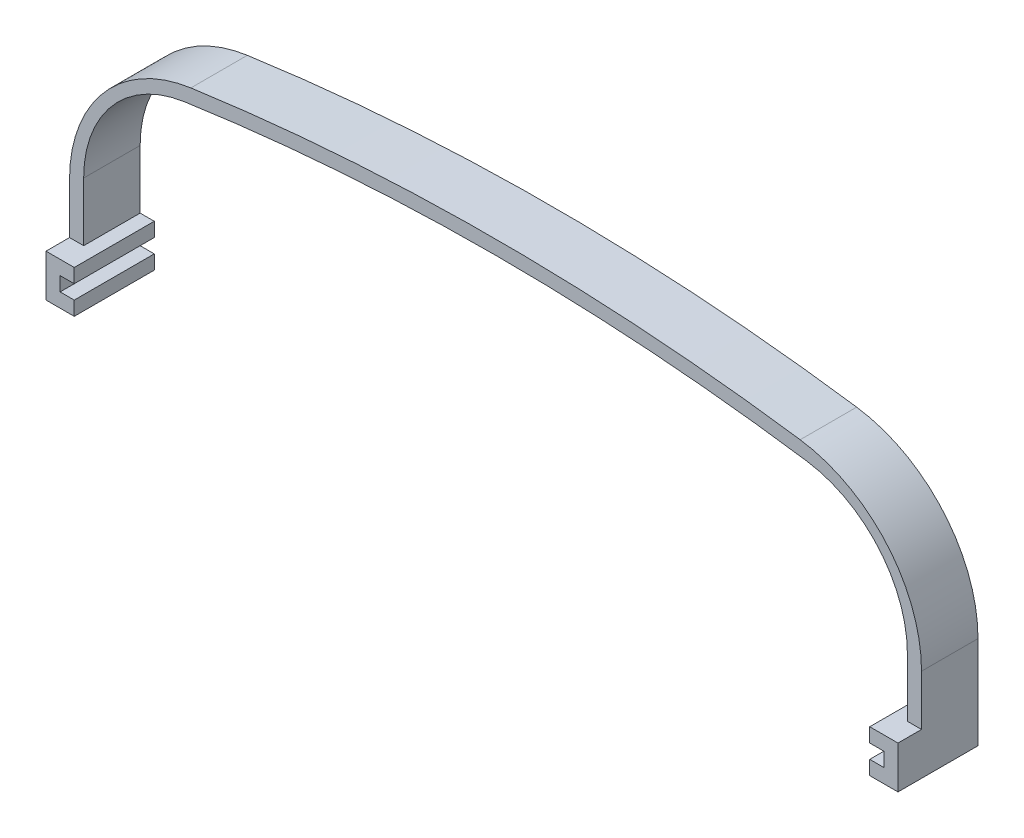
ISO-10303-21;
HEADER;
FILE_DESCRIPTION(('STEP AP214'),'2;1');
FILE_NAME('part.step','',(''),(''),'','','');
FILE_SCHEMA(('AUTOMOTIVE_DESIGN { 1 0 10303 214 1 1 1 1 }'));
ENDSEC;
DATA;
#1=APPLICATION_CONTEXT('core data for automotive mechanical design processes');
#2=APPLICATION_PROTOCOL_DEFINITION('international standard','automotive_design',2000,#1);
#3=PRODUCT_CONTEXT('',#1,'mechanical');
#4=PRODUCT('Part','Part','',(#3));
#5=PRODUCT_RELATED_PRODUCT_CATEGORY('part','',(#4));
#6=PRODUCT_DEFINITION_FORMATION('','',#4);
#7=PRODUCT_DEFINITION_CONTEXT('part definition',#1,'design');
#8=PRODUCT_DEFINITION('design','',#6,#7);
#9=PRODUCT_DEFINITION_SHAPE('','',#8);
#10=(LENGTH_UNIT() NAMED_UNIT(*) SI_UNIT(.MILLI.,.METRE.));
#11=(NAMED_UNIT(*) PLANE_ANGLE_UNIT() SI_UNIT($,.RADIAN.));
#12=(NAMED_UNIT(*) SI_UNIT($,.STERADIAN.) SOLID_ANGLE_UNIT());
#13=UNCERTAINTY_MEASURE_WITH_UNIT(LENGTH_MEASURE(1.E-05),#10,'distance_accuracy_value','');
#14=(GEOMETRIC_REPRESENTATION_CONTEXT(3) GLOBAL_UNCERTAINTY_ASSIGNED_CONTEXT((#13)) GLOBAL_UNIT_ASSIGNED_CONTEXT((#10,
#11,#12)) REPRESENTATION_CONTEXT('',''));
#15=CARTESIAN_POINT('',(0.,0.,0.));
#16=DIRECTION('',(0.,0.,1.));
#17=DIRECTION('',(1.,0.,0.));
#18=AXIS2_PLACEMENT_3D('',#15,#16,#17);
#19=CARTESIAN_POINT('',(0.,-408.513888888885,12.));
#20=DIRECTION('',(0.,0.,-1.));
#21=DIRECTION('',(-1.,0.,0.));
#22=AXIS2_PLACEMENT_3D('',#19,#20,#21);
#23=PLANE('',#22);
#24=CARTESIAN_POINT('',(0.,-408.513888888885,12.));
#25=DIRECTION('',(0.,0.,1.));
#26=DIRECTION('',(-1.,0.,0.));
#27=AXIS2_PLACEMENT_3D('',#24,#25,#26);
#28=CIRCLE('',#27,459.513888888885);
#29=CARTESIAN_POINT('',(64.7257073565077,46.4186301609036,12.));
#30=VERTEX_POINT('',#29);
#31=CARTESIAN_POINT('',(-64.7257073565077,46.4186301609036,12.));
#32=VERTEX_POINT('',#31);
#33=EDGE_CURVE('E330',#30,#32,#28,.T.);
#34=ORIENTED_EDGE('',*,*,#33,.T.);
#35=CARTESIAN_POINT('',(-60.5,16.7177312294376,12.));
#36=DIRECTION('',(0.,0.,-1.));
#37=DIRECTION('',(-1.,0.,0.));
#38=AXIS2_PLACEMENT_3D('',#35,#36,#37);
#39=CIRCLE('',#38,30.);
#40=CARTESIAN_POINT('',(-90.5,16.7177312294376,12.));
#41=VERTEX_POINT('',#40);
#42=EDGE_CURVE('E41',#32,#41,#39,.F.);
#43=ORIENTED_EDGE('',*,*,#42,.T.);
#44=DIRECTION('',(0.,1.,0.));
#45=VECTOR('',#44,1.);
#46=CARTESIAN_POINT('',(-90.5,-3.,12.));
#47=LINE('',#46,#45);
#48=CARTESIAN_POINT('',(-90.5,6.,12.));
#49=VERTEX_POINT('',#48);
#50=EDGE_CURVE('E260',#49,#41,#47,.T.);
#51=ORIENTED_EDGE('',*,*,#50,.F.);
#52=DIRECTION('',(1.,0.,0.));
#53=VECTOR('',#52,1.);
#54=CARTESIAN_POINT('',(-84.5,6.,12.));
#55=LINE('',#54,#53);
#56=CARTESIAN_POINT('',(-87.5,6.,12.));
#57=VERTEX_POINT('',#56);
#58=EDGE_CURVE('E233',#49,#57,#55,.T.);
#59=ORIENTED_EDGE('',*,*,#58,.T.);
#60=DIRECTION('',(0.,-1.,0.));
#61=VECTOR('',#60,1.);
#62=CARTESIAN_POINT('',(-87.5,6.,12.));
#63=LINE('',#62,#61);
#64=CARTESIAN_POINT('',(-87.5,18.4497937634092,12.));
#65=VERTEX_POINT('',#64);
#66=EDGE_CURVE('E258',#65,#57,#63,.T.);
#67=ORIENTED_EDGE('',*,*,#66,.F.);
#68=CARTESIAN_POINT('',(-62.5,18.4497937634092,12.));
#69=DIRECTION('',(0.,0.,-1.));
#70=DIRECTION('',(-1.,0.,0.));
#71=AXIS2_PLACEMENT_3D('',#68,#69,#70);
#72=CIRCLE('',#71,25.);
#73=CARTESIAN_POINT('',(-66.1209726737263,43.186175004329,12.));
#74=VERTEX_POINT('',#73);
#75=EDGE_CURVE('E396',#65,#74,#72,.T.);
#76=ORIENTED_EDGE('',*,*,#75,.T.);
#77=CARTESIAN_POINT('',(0.,-408.513888888885,12.));
#78=DIRECTION('',(0.,0.,-1.));
#79=DIRECTION('',(1.,0.,0.));
#80=AXIS2_PLACEMENT_3D('',#77,#78,#79);
#81=CIRCLE('',#80,456.513888888885);
#82=CARTESIAN_POINT('',(66.1209726737263,43.186175004329,12.));
#83=VERTEX_POINT('',#82);
#84=EDGE_CURVE('E333',#74,#83,#81,.T.);
#85=ORIENTED_EDGE('',*,*,#84,.T.);
#86=CARTESIAN_POINT('',(62.5,18.4497937634092,12.));
#87=DIRECTION('',(0.,0.,-1.));
#88=DIRECTION('',(-1.,0.,0.));
#89=AXIS2_PLACEMENT_3D('',#86,#87,#88);
#90=CIRCLE('',#89,25.);
#91=CARTESIAN_POINT('',(87.5,18.4497937634092,12.));
#92=VERTEX_POINT('',#91);
#93=EDGE_CURVE('E400',#83,#92,#90,.T.);
#94=ORIENTED_EDGE('',*,*,#93,.T.);
#95=DIRECTION('',(0.,-1.,0.));
#96=VECTOR('',#95,1.);
#97=CARTESIAN_POINT('',(87.5,6.,12.));
#98=LINE('',#97,#96);
#99=CARTESIAN_POINT('',(87.5,6.,12.));
#100=VERTEX_POINT('',#99);
#101=EDGE_CURVE('E336',#92,#100,#98,.T.);
#102=ORIENTED_EDGE('',*,*,#101,.T.);
#103=DIRECTION('',(-1.,0.,0.));
#104=VECTOR('',#103,1.);
#105=CARTESIAN_POINT('',(84.5,6.,12.));
#106=LINE('',#105,#104);
#107=CARTESIAN_POINT('',(90.5,6.,12.));
#108=VERTEX_POINT('',#107);
#109=EDGE_CURVE('E297',#108,#100,#106,.T.);
#110=ORIENTED_EDGE('',*,*,#109,.F.);
#111=DIRECTION('',(0.,1.,0.));
#112=VECTOR('',#111,1.);
#113=CARTESIAN_POINT('',(90.5,-3.,12.));
#114=LINE('',#113,#112);
#115=CARTESIAN_POINT('',(90.5,16.7177312294376,12.));
#116=VERTEX_POINT('',#115);
#117=EDGE_CURVE('E328',#108,#116,#114,.T.);
#118=ORIENTED_EDGE('',*,*,#117,.T.);
#119=CARTESIAN_POINT('',(60.5,16.7177312294376,12.));
#120=DIRECTION('',(0.,0.,-1.));
#121=DIRECTION('',(-1.,0.,0.));
#122=AXIS2_PLACEMENT_3D('',#119,#120,#121);
#123=CIRCLE('',#122,30.);
#124=EDGE_CURVE('E412',#116,#30,#123,.F.);
#125=ORIENTED_EDGE('',*,*,#124,.T.);
#126=EDGE_LOOP('',(#34,#43,#51,#59,#67,#76,#85,#94,#102,#110,#118,#125));
#127=FACE_BOUND('',#126,.T.);
#128=ADVANCED_FACE('F33',(#127),#23,.F.);
#129=CARTESIAN_POINT('',(84.5,0.,12.));
#130=DIRECTION('',(1.,0.,0.));
#131=DIRECTION('',(0.,0.,-1.));
#132=AXIS2_PLACEMENT_3D('',#129,#130,#131);
#133=PLANE('',#132);
#134=DIRECTION('',(0.,-1.,0.));
#135=VECTOR('',#134,1.);
#136=CARTESIAN_POINT('',(84.5,0.,0.));
#137=LINE('',#136,#135);
#138=CARTESIAN_POINT('',(84.5,0.,0.));
#139=VERTEX_POINT('',#138);
#140=CARTESIAN_POINT('',(84.5,-3.,0.));
#141=VERTEX_POINT('',#140);
#142=EDGE_CURVE('E327',#139,#141,#137,.T.);
#143=ORIENTED_EDGE('',*,*,#142,.T.);
#144=DIRECTION('',(0.,0.,-1.));
#145=VECTOR('',#144,1.);
#146=CARTESIAN_POINT('',(84.5,-3.,12.));
#147=LINE('',#146,#145);
#148=CARTESIAN_POINT('',(84.5,-3.,17.));
#149=VERTEX_POINT('',#148);
#150=EDGE_CURVE('E381',#149,#141,#147,.T.);
#151=ORIENTED_EDGE('',*,*,#150,.F.);
#152=DIRECTION('',(0.,-1.,0.));
#153=VECTOR('',#152,1.);
#154=CARTESIAN_POINT('',(84.5,-3.,17.));
#155=LINE('',#154,#153);
#156=CARTESIAN_POINT('',(84.5,0.,17.));
#157=VERTEX_POINT('',#156);
#158=EDGE_CURVE('E316',#157,#149,#155,.T.);
#159=ORIENTED_EDGE('',*,*,#158,.F.);
#160=DIRECTION('',(0.,0.,-1.));
#161=VECTOR('',#160,1.);
#162=CARTESIAN_POINT('',(84.5,0.,12.));
#163=LINE('',#162,#161);
#164=EDGE_CURVE('E338',#157,#139,#163,.T.);
#165=ORIENTED_EDGE('',*,*,#164,.T.);
#166=EDGE_LOOP('',(#143,#151,#159,#165));
#167=FACE_BOUND('',#166,.T.);
#168=ADVANCED_FACE('F439',(#167),#133,.F.);
#169=CARTESIAN_POINT('',(84.5,-3.,12.));
#170=DIRECTION('',(0.,1.,0.));
#171=DIRECTION('',(0.,0.,1.));
#172=AXIS2_PLACEMENT_3D('',#169,#170,#171);
#173=PLANE('',#172);
#174=DIRECTION('',(1.,0.,0.));
#175=VECTOR('',#174,1.);
#176=CARTESIAN_POINT('',(84.5,-3.,0.));
#177=LINE('',#176,#175);
#178=CARTESIAN_POINT('',(90.5,-3.,0.));
#179=VERTEX_POINT('',#178);
#180=EDGE_CURVE('E341',#141,#179,#177,.T.);
#181=ORIENTED_EDGE('',*,*,#180,.T.);
#182=DIRECTION('',(0.,0.,-1.));
#183=VECTOR('',#182,1.);
#184=CARTESIAN_POINT('',(90.5,-3.,12.));
#185=LINE('',#184,#183);
#186=CARTESIAN_POINT('',(90.5,-3.,17.));
#187=VERTEX_POINT('',#186);
#188=EDGE_CURVE('E378',#187,#179,#185,.T.);
#189=ORIENTED_EDGE('',*,*,#188,.F.);
#190=DIRECTION('',(1.,0.,0.));
#191=VECTOR('',#190,1.);
#192=CARTESIAN_POINT('',(90.5,-3.,17.));
#193=LINE('',#192,#191);
#194=EDGE_CURVE('E319',#149,#187,#193,.T.);
#195=ORIENTED_EDGE('',*,*,#194,.F.);
#196=ORIENTED_EDGE('',*,*,#150,.T.);
#197=EDGE_LOOP('',(#181,#189,#195,#196));
#198=FACE_BOUND('',#197,.T.);
#199=ADVANCED_FACE('F433',(#198),#173,.F.);
#200=CARTESIAN_POINT('',(90.5,-3.,12.));
#201=DIRECTION('',(-1.,0.,0.));
#202=DIRECTION('',(0.,0.,1.));
#203=AXIS2_PLACEMENT_3D('',#200,#201,#202);
#204=PLANE('',#203);
#205=DIRECTION('',(0.,1.,0.));
#206=VECTOR('',#205,1.);
#207=CARTESIAN_POINT('',(90.5,-3.,0.));
#208=LINE('',#207,#206);
#209=CARTESIAN_POINT('',(90.5,16.7177312294376,0.));
#210=VERTEX_POINT('',#209);
#211=EDGE_CURVE('E343',#179,#210,#208,.T.);
#212=ORIENTED_EDGE('',*,*,#211,.T.);
#213=DIRECTION('',(0.,0.,-1.));
#214=VECTOR('',#213,1.);
#215=CARTESIAN_POINT('',(90.5,16.7177312294376,12.));
#216=LINE('',#215,#214);
#217=EDGE_CURVE('E11',#210,#116,#216,.F.);
#218=ORIENTED_EDGE('',*,*,#217,.T.);
#219=ORIENTED_EDGE('',*,*,#117,.F.);
#220=DIRECTION('',(0.,0.,-1.));
#221=VECTOR('',#220,1.);
#222=CARTESIAN_POINT('',(90.5,6.,17.));
#223=LINE('',#222,#221);
#224=CARTESIAN_POINT('',(90.5,6.,17.));
#225=VERTEX_POINT('',#224);
#226=EDGE_CURVE('E322',#225,#108,#223,.T.);
#227=ORIENTED_EDGE('',*,*,#226,.F.);
#228=DIRECTION('',(0.,1.,0.));
#229=VECTOR('',#228,1.);
#230=CARTESIAN_POINT('',(90.5,6.,17.));
#231=LINE('',#230,#229);
#232=EDGE_CURVE('E298',#187,#225,#231,.T.);
#233=ORIENTED_EDGE('',*,*,#232,.F.);
#234=ORIENTED_EDGE('',*,*,#188,.T.);
#235=EDGE_LOOP('',(#212,#218,#219,#227,#233,#234));
#236=FACE_BOUND('',#235,.T.);
#237=ADVANCED_FACE('F428',(#236),#204,.F.);
#238=CARTESIAN_POINT('',(0.,-408.513888888885,12.));
#239=DIRECTION('',(0.,0.,-1.));
#240=DIRECTION('',(-1.,0.,0.));
#241=AXIS2_PLACEMENT_3D('',#238,#239,#240);
#242=CYLINDRICAL_SURFACE('',#241,459.513888888885);
#243=CARTESIAN_POINT('',(0.,-408.513888888885,0.));
#244=DIRECTION('',(0.,0.,1.));
#245=DIRECTION('',(-1.,0.,0.));
#246=AXIS2_PLACEMENT_3D('',#243,#244,#245);
#247=CIRCLE('',#246,459.513888888885);
#248=CARTESIAN_POINT('',(64.7257073565077,46.4186301609036,0.));
#249=VERTEX_POINT('',#248);
#250=CARTESIAN_POINT('',(-64.7257073565077,46.4186301609036,0.));
#251=VERTEX_POINT('',#250);
#252=EDGE_CURVE('E345',#249,#251,#247,.T.);
#253=ORIENTED_EDGE('',*,*,#252,.T.);
#254=DIRECTION('',(0.,0.,-1.));
#255=VECTOR('',#254,1.);
#256=CARTESIAN_POINT('',(-64.7257073565077,46.4186301609037,12.));
#257=LINE('',#256,#255);
#258=EDGE_CURVE('E54',#251,#32,#257,.F.);
#259=ORIENTED_EDGE('',*,*,#258,.T.);
#260=ORIENTED_EDGE('',*,*,#33,.F.);
#261=DIRECTION('',(0.,0.,-1.));
#262=VECTOR('',#261,1.);
#263=CARTESIAN_POINT('',(64.7257073565077,46.4186301609037,12.));
#264=LINE('',#263,#262);
#265=EDGE_CURVE('E408',#30,#249,#264,.T.);
#266=ORIENTED_EDGE('',*,*,#265,.T.);
#267=EDGE_LOOP('',(#253,#259,#260,#266));
#268=FACE_BOUND('',#267,.T.);
#269=ADVANCED_FACE('F423',(#268),#242,.T.);
#270=CARTESIAN_POINT('',(0.,-408.513888888885,12.));
#271=DIRECTION('',(0.,0.,-1.));
#272=DIRECTION('',(-1.,0.,0.));
#273=AXIS2_PLACEMENT_3D('',#270,#271,#272);
#274=CYLINDRICAL_SURFACE('',#273,456.513888888885);
#275=ORIENTED_EDGE('',*,*,#84,.F.);
#276=DIRECTION('',(0.,0.,-1.));
#277=VECTOR('',#276,1.);
#278=CARTESIAN_POINT('',(-66.1209726737263,43.1861750043291,12.));
#279=LINE('',#278,#277);
#280=CARTESIAN_POINT('',(-66.1209726737263,43.186175004329,0.));
#281=VERTEX_POINT('',#280);
#282=EDGE_CURVE('E386',#74,#281,#279,.T.);
#283=ORIENTED_EDGE('',*,*,#282,.T.);
#284=CARTESIAN_POINT('',(0.,-408.513888888885,0.));
#285=DIRECTION('',(0.,0.,-1.));
#286=DIRECTION('',(1.,0.,0.));
#287=AXIS2_PLACEMENT_3D('',#284,#285,#286);
#288=CIRCLE('',#287,456.513888888885);
#289=CARTESIAN_POINT('',(66.1209726737263,43.186175004329,0.));
#290=VERTEX_POINT('',#289);
#291=EDGE_CURVE('E347',#281,#290,#288,.T.);
#292=ORIENTED_EDGE('',*,*,#291,.T.);
#293=DIRECTION('',(0.,0.,-1.));
#294=VECTOR('',#293,1.);
#295=CARTESIAN_POINT('',(66.1209726737263,43.1861750043291,12.));
#296=LINE('',#295,#294);
#297=EDGE_CURVE('E384',#290,#83,#296,.F.);
#298=ORIENTED_EDGE('',*,*,#297,.T.);
#299=EDGE_LOOP('',(#275,#283,#292,#298));
#300=FACE_BOUND('',#299,.T.);
#301=ADVANCED_FACE('F470',(#300),#274,.F.);
#302=CARTESIAN_POINT('',(87.5,6.,12.));
#303=DIRECTION('',(1.,0.,0.));
#304=DIRECTION('',(0.,0.,-1.));
#305=AXIS2_PLACEMENT_3D('',#302,#303,#304);
#306=PLANE('',#305);
#307=ORIENTED_EDGE('',*,*,#101,.F.);
#308=DIRECTION('',(0.,0.,1.));
#309=VECTOR('',#308,1.);
#310=CARTESIAN_POINT('',(87.5,18.4497937634092,0.));
#311=LINE('',#310,#309);
#312=CARTESIAN_POINT('',(87.5,18.4497937634092,0.));
#313=VERTEX_POINT('',#312);
#314=EDGE_CURVE('E391',#92,#313,#311,.F.);
#315=ORIENTED_EDGE('',*,*,#314,.T.);
#316=DIRECTION('',(0.,-1.,0.));
#317=VECTOR('',#316,1.);
#318=CARTESIAN_POINT('',(87.5,6.,0.));
#319=LINE('',#318,#317);
#320=CARTESIAN_POINT('',(87.5,6.,0.));
#321=VERTEX_POINT('',#320);
#322=EDGE_CURVE('E350',#313,#321,#319,.T.);
#323=ORIENTED_EDGE('',*,*,#322,.T.);
#324=DIRECTION('',(0.,0.,-1.));
#325=VECTOR('',#324,1.);
#326=CARTESIAN_POINT('',(87.5,6.,12.));
#327=LINE('',#326,#325);
#328=EDGE_CURVE('E375',#100,#321,#327,.T.);
#329=ORIENTED_EDGE('',*,*,#328,.F.);
#330=EDGE_LOOP('',(#307,#315,#323,#329));
#331=FACE_BOUND('',#330,.T.);
#332=ADVANCED_FACE('F463',(#331),#306,.F.);
#333=CARTESIAN_POINT('',(84.5,6.,12.));
#334=DIRECTION('',(0.,-1.,0.));
#335=DIRECTION('',(1.,0.,0.));
#336=AXIS2_PLACEMENT_3D('',#333,#334,#335);
#337=PLANE('',#336);
#338=DIRECTION('',(-1.,0.,0.));
#339=VECTOR('',#338,1.);
#340=CARTESIAN_POINT('',(84.5,6.,0.));
#341=LINE('',#340,#339);
#342=CARTESIAN_POINT('',(84.5,6.,0.));
#343=VERTEX_POINT('',#342);
#344=EDGE_CURVE('E352',#321,#343,#341,.T.);
#345=ORIENTED_EDGE('',*,*,#344,.T.);
#346=DIRECTION('',(0.,0.,-1.));
#347=VECTOR('',#346,1.);
#348=CARTESIAN_POINT('',(84.5,6.,12.));
#349=LINE('',#348,#347);
#350=CARTESIAN_POINT('',(84.5,6.,17.));
#351=VERTEX_POINT('',#350);
#352=EDGE_CURVE('E372',#351,#343,#349,.T.);
#353=ORIENTED_EDGE('',*,*,#352,.F.);
#354=DIRECTION('',(-1.,0.,0.));
#355=VECTOR('',#354,1.);
#356=CARTESIAN_POINT('',(84.5,6.,17.));
#357=LINE('',#356,#355);
#358=EDGE_CURVE('E301',#225,#351,#357,.T.);
#359=ORIENTED_EDGE('',*,*,#358,.F.);
#360=ORIENTED_EDGE('',*,*,#226,.T.);
#361=ORIENTED_EDGE('',*,*,#109,.T.);
#362=ORIENTED_EDGE('',*,*,#328,.T.);
#363=EDGE_LOOP('',(#345,#353,#359,#360,#361,#362));
#364=FACE_BOUND('',#363,.T.);
#365=ADVANCED_FACE('F459',(#364),#337,.F.);
#366=CARTESIAN_POINT('',(84.5,3.,12.));
#367=DIRECTION('',(1.,0.,0.));
#368=DIRECTION('',(0.,0.,-1.));
#369=AXIS2_PLACEMENT_3D('',#366,#367,#368);
#370=PLANE('',#369);
#371=DIRECTION('',(0.,-1.,0.));
#372=VECTOR('',#371,1.);
#373=CARTESIAN_POINT('',(84.5,3.,0.));
#374=LINE('',#373,#372);
#375=CARTESIAN_POINT('',(84.5,3.,0.));
#376=VERTEX_POINT('',#375);
#377=EDGE_CURVE('E354',#343,#376,#374,.T.);
#378=ORIENTED_EDGE('',*,*,#377,.T.);
#379=DIRECTION('',(0.,0.,-1.));
#380=VECTOR('',#379,1.);
#381=CARTESIAN_POINT('',(84.5,3.,12.));
#382=LINE('',#381,#380);
#383=CARTESIAN_POINT('',(84.5,3.,17.));
#384=VERTEX_POINT('',#383);
#385=EDGE_CURVE('E369',#384,#376,#382,.T.);
#386=ORIENTED_EDGE('',*,*,#385,.F.);
#387=DIRECTION('',(0.,-1.,0.));
#388=VECTOR('',#387,1.);
#389=CARTESIAN_POINT('',(84.5,3.,17.));
#390=LINE('',#389,#388);
#391=EDGE_CURVE('E304',#351,#384,#390,.T.);
#392=ORIENTED_EDGE('',*,*,#391,.F.);
#393=ORIENTED_EDGE('',*,*,#352,.T.);
#394=EDGE_LOOP('',(#378,#386,#392,#393));
#395=FACE_BOUND('',#394,.T.);
#396=ADVANCED_FACE('F457',(#395),#370,.F.);
#397=CARTESIAN_POINT('',(87.5,3.,12.));
#398=DIRECTION('',(0.,1.,0.));
#399=DIRECTION('',(-1.,0.,0.));
#400=AXIS2_PLACEMENT_3D('',#397,#398,#399);
#401=PLANE('',#400);
#402=DIRECTION('',(1.,0.,0.));
#403=VECTOR('',#402,1.);
#404=CARTESIAN_POINT('',(87.5,3.,0.));
#405=LINE('',#404,#403);
#406=CARTESIAN_POINT('',(87.5,3.,0.));
#407=VERTEX_POINT('',#406);
#408=EDGE_CURVE('E356',#376,#407,#405,.T.);
#409=ORIENTED_EDGE('',*,*,#408,.T.);
#410=DIRECTION('',(0.,0.,-1.));
#411=VECTOR('',#410,1.);
#412=CARTESIAN_POINT('',(87.5,3.,12.));
#413=LINE('',#412,#411);
#414=CARTESIAN_POINT('',(87.5,3.,17.));
#415=VERTEX_POINT('',#414);
#416=EDGE_CURVE('E366',#415,#407,#413,.T.);
#417=ORIENTED_EDGE('',*,*,#416,.F.);
#418=DIRECTION('',(1.,0.,0.));
#419=VECTOR('',#418,1.);
#420=CARTESIAN_POINT('',(87.5,3.,17.));
#421=LINE('',#420,#419);
#422=EDGE_CURVE('E307',#384,#415,#421,.T.);
#423=ORIENTED_EDGE('',*,*,#422,.F.);
#424=ORIENTED_EDGE('',*,*,#385,.T.);
#425=EDGE_LOOP('',(#409,#417,#423,#424));
#426=FACE_BOUND('',#425,.T.);
#427=ADVANCED_FACE('F452',(#426),#401,.F.);
#428=CARTESIAN_POINT('',(87.5,0.,12.));
#429=DIRECTION('',(1.,0.,0.));
#430=DIRECTION('',(0.,0.,-1.));
#431=AXIS2_PLACEMENT_3D('',#428,#429,#430);
#432=PLANE('',#431);
#433=DIRECTION('',(0.,-1.,0.));
#434=VECTOR('',#433,1.);
#435=CARTESIAN_POINT('',(87.5,0.,0.));
#436=LINE('',#435,#434);
#437=CARTESIAN_POINT('',(87.5,0.,0.));
#438=VERTEX_POINT('',#437);
#439=EDGE_CURVE('E358',#407,#438,#436,.T.);
#440=ORIENTED_EDGE('',*,*,#439,.T.);
#441=DIRECTION('',(0.,0.,-1.));
#442=VECTOR('',#441,1.);
#443=CARTESIAN_POINT('',(87.5,0.,12.));
#444=LINE('',#443,#442);
#445=CARTESIAN_POINT('',(87.5,0.,17.));
#446=VERTEX_POINT('',#445);
#447=EDGE_CURVE('E363',#446,#438,#444,.T.);
#448=ORIENTED_EDGE('',*,*,#447,.F.);
#449=DIRECTION('',(0.,-1.,0.));
#450=VECTOR('',#449,1.);
#451=CARTESIAN_POINT('',(87.5,0.,17.));
#452=LINE('',#451,#450);
#453=EDGE_CURVE('E310',#415,#446,#452,.T.);
#454=ORIENTED_EDGE('',*,*,#453,.F.);
#455=ORIENTED_EDGE('',*,*,#416,.T.);
#456=EDGE_LOOP('',(#440,#448,#454,#455));
#457=FACE_BOUND('',#456,.T.);
#458=ADVANCED_FACE('F448',(#457),#432,.F.);
#459=CARTESIAN_POINT('',(84.5,0.,12.));
#460=DIRECTION('',(0.,-1.,0.));
#461=DIRECTION('',(0.,0.,-1.));
#462=AXIS2_PLACEMENT_3D('',#459,#460,#461);
#463=PLANE('',#462);
#464=DIRECTION('',(-1.,0.,0.));
#465=VECTOR('',#464,1.);
#466=CARTESIAN_POINT('',(84.5,0.,0.));
#467=LINE('',#466,#465);
#468=EDGE_CURVE('E331',#438,#139,#467,.T.);
#469=ORIENTED_EDGE('',*,*,#468,.T.);
#470=ORIENTED_EDGE('',*,*,#164,.F.);
#471=DIRECTION('',(-1.,0.,0.));
#472=VECTOR('',#471,1.);
#473=CARTESIAN_POINT('',(84.5,0.,17.));
#474=LINE('',#473,#472);
#475=EDGE_CURVE('E313',#446,#157,#474,.T.);
#476=ORIENTED_EDGE('',*,*,#475,.F.);
#477=ORIENTED_EDGE('',*,*,#447,.T.);
#478=EDGE_LOOP('',(#469,#470,#476,#477));
#479=FACE_BOUND('',#478,.T.);
#480=ADVANCED_FACE('F445',(#479),#463,.F.);
#481=CARTESIAN_POINT('',(0.,-408.513888888885,0.));
#482=DIRECTION('',(0.,0.,-1.));
#483=DIRECTION('',(-1.,0.,0.));
#484=AXIS2_PLACEMENT_3D('',#481,#482,#483);
#485=PLANE('',#484);
#486=DIRECTION('',(0.,1.,0.));
#487=VECTOR('',#486,1.);
#488=CARTESIAN_POINT('',(-90.5,-3.,0.));
#489=LINE('',#488,#487);
#490=CARTESIAN_POINT('',(-90.5,-3.,0.));
#491=VERTEX_POINT('',#490);
#492=CARTESIAN_POINT('',(-90.5,16.7177312294376,0.));
#493=VERTEX_POINT('',#492);
#494=EDGE_CURVE('E216',#491,#493,#489,.T.);
#495=ORIENTED_EDGE('',*,*,#494,.T.);
#496=CARTESIAN_POINT('',(-60.5,16.7177312294376,0.));
#497=DIRECTION('',(0.,0.,-1.));
#498=DIRECTION('',(-1.,0.,0.));
#499=AXIS2_PLACEMENT_3D('',#496,#497,#498);
#500=CIRCLE('',#499,30.);
#501=EDGE_CURVE('E406',#493,#251,#500,.T.);
#502=ORIENTED_EDGE('',*,*,#501,.T.);
#503=ORIENTED_EDGE('',*,*,#252,.F.);
#504=CARTESIAN_POINT('',(60.5,16.7177312294376,0.));
#505=DIRECTION('',(0.,0.,-1.));
#506=DIRECTION('',(-1.,0.,0.));
#507=AXIS2_PLACEMENT_3D('',#504,#505,#506);
#508=CIRCLE('',#507,30.);
#509=EDGE_CURVE('E404',#249,#210,#508,.T.);
#510=ORIENTED_EDGE('',*,*,#509,.T.);
#511=ORIENTED_EDGE('',*,*,#211,.F.);
#512=ORIENTED_EDGE('',*,*,#180,.F.);
#513=ORIENTED_EDGE('',*,*,#142,.F.);
#514=ORIENTED_EDGE('',*,*,#468,.F.);
#515=ORIENTED_EDGE('',*,*,#439,.F.);
#516=ORIENTED_EDGE('',*,*,#408,.F.);
#517=ORIENTED_EDGE('',*,*,#377,.F.);
#518=ORIENTED_EDGE('',*,*,#344,.F.);
#519=ORIENTED_EDGE('',*,*,#322,.F.);
#520=CARTESIAN_POINT('',(62.5,18.4497937634092,0.));
#521=DIRECTION('',(0.,0.,-1.));
#522=DIRECTION('',(-1.,0.,0.));
#523=AXIS2_PLACEMENT_3D('',#520,#521,#522);
#524=CIRCLE('',#523,25.);
#525=EDGE_CURVE('E398',#313,#290,#524,.F.);
#526=ORIENTED_EDGE('',*,*,#525,.T.);
#527=ORIENTED_EDGE('',*,*,#291,.F.);
#528=CARTESIAN_POINT('',(-62.5,18.4497937634092,0.));
#529=DIRECTION('',(0.,0.,-1.));
#530=DIRECTION('',(-1.,0.,0.));
#531=AXIS2_PLACEMENT_3D('',#528,#529,#530);
#532=CIRCLE('',#531,25.);
#533=CARTESIAN_POINT('',(-87.5,18.4497937634092,0.));
#534=VERTEX_POINT('',#533);
#535=EDGE_CURVE('E394',#281,#534,#532,.F.);
#536=ORIENTED_EDGE('',*,*,#535,.T.);
#537=DIRECTION('',(0.,-1.,0.));
#538=VECTOR('',#537,1.);
#539=CARTESIAN_POINT('',(-87.5,6.,0.));
#540=LINE('',#539,#538);
#541=CARTESIAN_POINT('',(-87.5,6.,0.));
#542=VERTEX_POINT('',#541);
#543=EDGE_CURVE('E280',#534,#542,#540,.T.);
#544=ORIENTED_EDGE('',*,*,#543,.T.);
#545=DIRECTION('',(1.,0.,0.));
#546=VECTOR('',#545,1.);
#547=CARTESIAN_POINT('',(-84.5,6.,0.));
#548=LINE('',#547,#546);
#549=CARTESIAN_POINT('',(-84.5,6.,0.));
#550=VERTEX_POINT('',#549);
#551=EDGE_CURVE('E277',#542,#550,#548,.T.);
#552=ORIENTED_EDGE('',*,*,#551,.T.);
#553=DIRECTION('',(0.,-1.,0.));
#554=VECTOR('',#553,1.);
#555=CARTESIAN_POINT('',(-84.5,3.,0.));
#556=LINE('',#555,#554);
#557=CARTESIAN_POINT('',(-84.5,3.,0.));
#558=VERTEX_POINT('',#557);
#559=EDGE_CURVE('E274',#550,#558,#556,.T.);
#560=ORIENTED_EDGE('',*,*,#559,.T.);
#561=DIRECTION('',(-1.,0.,0.));
#562=VECTOR('',#561,1.);
#563=CARTESIAN_POINT('',(-87.5,3.,0.));
#564=LINE('',#563,#562);
#565=CARTESIAN_POINT('',(-87.5,3.,0.));
#566=VERTEX_POINT('',#565);
#567=EDGE_CURVE('E271',#558,#566,#564,.T.);
#568=ORIENTED_EDGE('',*,*,#567,.T.);
#569=DIRECTION('',(0.,-1.,0.));
#570=VECTOR('',#569,1.);
#571=CARTESIAN_POINT('',(-87.5,0.,0.));
#572=LINE('',#571,#570);
#573=CARTESIAN_POINT('',(-87.5,0.,0.));
#574=VERTEX_POINT('',#573);
#575=EDGE_CURVE('E268',#566,#574,#572,.T.);
#576=ORIENTED_EDGE('',*,*,#575,.T.);
#577=DIRECTION('',(1.,0.,0.));
#578=VECTOR('',#577,1.);
#579=CARTESIAN_POINT('',(-84.5,0.,0.));
#580=LINE('',#579,#578);
#581=CARTESIAN_POINT('',(-84.5,0.,0.));
#582=VERTEX_POINT('',#581);
#583=EDGE_CURVE('E265',#574,#582,#580,.T.);
#584=ORIENTED_EDGE('',*,*,#583,.T.);
#585=DIRECTION('',(0.,-1.,0.));
#586=VECTOR('',#585,1.);
#587=CARTESIAN_POINT('',(-84.5,0.,0.));
#588=LINE('',#587,#586);
#589=CARTESIAN_POINT('',(-84.5,-3.,0.));
#590=VERTEX_POINT('',#589);
#591=EDGE_CURVE('E257',#582,#590,#588,.T.);
#592=ORIENTED_EDGE('',*,*,#591,.T.);
#593=DIRECTION('',(-1.,0.,0.));
#594=VECTOR('',#593,1.);
#595=CARTESIAN_POINT('',(-84.5,-3.,0.));
#596=LINE('',#595,#594);
#597=EDGE_CURVE('E261',#590,#491,#596,.T.);
#598=ORIENTED_EDGE('',*,*,#597,.T.);
#599=EDGE_LOOP('',(#495,#502,#503,#510,#511,#512,#513,#514,#515,#516,#517,#518,#519,#526,#527,
#536,#544,#552,#560,#568,#576,#584,#592,#598));
#600=FACE_BOUND('',#599,.T.);
#601=ADVANCED_FACE('F422',(#600),#485,.T.);
#602=CARTESIAN_POINT('',(0.,0.,17.));
#603=DIRECTION('',(0.,0.,-1.));
#604=DIRECTION('',(-1.,0.,0.));
#605=AXIS2_PLACEMENT_3D('',#602,#603,#604);
#606=PLANE('',#605);
#607=ORIENTED_EDGE('',*,*,#232,.T.);
#608=ORIENTED_EDGE('',*,*,#358,.T.);
#609=ORIENTED_EDGE('',*,*,#391,.T.);
#610=ORIENTED_EDGE('',*,*,#422,.T.);
#611=ORIENTED_EDGE('',*,*,#453,.T.);
#612=ORIENTED_EDGE('',*,*,#475,.T.);
#613=ORIENTED_EDGE('',*,*,#158,.T.);
#614=ORIENTED_EDGE('',*,*,#194,.T.);
#615=EDGE_LOOP('',(#607,#608,#609,#610,#611,#612,#613,#614));
#616=FACE_BOUND('',#615,.T.);
#617=ADVANCED_FACE('F435',(#616),#606,.F.);
#618=CARTESIAN_POINT('',(-84.5,0.,12.));
#619=DIRECTION('',(1.,0.,0.));
#620=DIRECTION('',(0.,0.,-1.));
#621=AXIS2_PLACEMENT_3D('',#618,#619,#620);
#622=PLANE('',#621);
#623=ORIENTED_EDGE('',*,*,#591,.F.);
#624=DIRECTION('',(0.,0.,-1.));
#625=VECTOR('',#624,1.);
#626=CARTESIAN_POINT('',(-84.5,0.,12.));
#627=LINE('',#626,#625);
#628=CARTESIAN_POINT('',(-84.5,0.,17.));
#629=VERTEX_POINT('',#628);
#630=EDGE_CURVE('E295',#629,#582,#627,.T.);
#631=ORIENTED_EDGE('',*,*,#630,.F.);
#632=DIRECTION('',(0.,-1.,0.));
#633=VECTOR('',#632,1.);
#634=CARTESIAN_POINT('',(-84.5,-3.,17.));
#635=LINE('',#634,#633);
#636=CARTESIAN_POINT('',(-84.5,-3.,17.));
#637=VERTEX_POINT('',#636);
#638=EDGE_CURVE('E236',#629,#637,#635,.T.);
#639=ORIENTED_EDGE('',*,*,#638,.T.);
#640=DIRECTION('',(0.,0.,-1.));
#641=VECTOR('',#640,1.);
#642=CARTESIAN_POINT('',(-84.5,-3.,12.));
#643=LINE('',#642,#641);
#644=EDGE_CURVE('E222',#637,#590,#643,.T.);
#645=ORIENTED_EDGE('',*,*,#644,.T.);
#646=EDGE_LOOP('',(#623,#631,#639,#645));
#647=FACE_BOUND('',#646,.T.);
#648=ADVANCED_FACE('F503',(#647),#622,.T.);
#649=CARTESIAN_POINT('',(-84.5,0.,12.));
#650=DIRECTION('',(0.,1.,0.));
#651=DIRECTION('',(0.,0.,1.));
#652=AXIS2_PLACEMENT_3D('',#649,#650,#651);
#653=PLANE('',#652);
#654=ORIENTED_EDGE('',*,*,#583,.F.);
#655=DIRECTION('',(0.,0.,-1.));
#656=VECTOR('',#655,1.);
#657=CARTESIAN_POINT('',(-87.5,0.,12.));
#658=LINE('',#657,#656);
#659=CARTESIAN_POINT('',(-87.5,0.,17.));
#660=VERTEX_POINT('',#659);
#661=EDGE_CURVE('E293',#660,#574,#658,.T.);
#662=ORIENTED_EDGE('',*,*,#661,.F.);
#663=DIRECTION('',(1.,0.,0.));
#664=VECTOR('',#663,1.);
#665=CARTESIAN_POINT('',(-84.5,0.,17.));
#666=LINE('',#665,#664);
#667=EDGE_CURVE('E238',#660,#629,#666,.T.);
#668=ORIENTED_EDGE('',*,*,#667,.T.);
#669=ORIENTED_EDGE('',*,*,#630,.T.);
#670=EDGE_LOOP('',(#654,#662,#668,#669));
#671=FACE_BOUND('',#670,.T.);
#672=ADVANCED_FACE('F500',(#671),#653,.T.);
#673=CARTESIAN_POINT('',(-87.5,0.,12.));
#674=DIRECTION('',(1.,0.,0.));
#675=DIRECTION('',(0.,0.,-1.));
#676=AXIS2_PLACEMENT_3D('',#673,#674,#675);
#677=PLANE('',#676);
#678=ORIENTED_EDGE('',*,*,#575,.F.);
#679=DIRECTION('',(0.,0.,-1.));
#680=VECTOR('',#679,1.);
#681=CARTESIAN_POINT('',(-87.5,3.,12.));
#682=LINE('',#681,#680);
#683=CARTESIAN_POINT('',(-87.5,3.,17.));
#684=VERTEX_POINT('',#683);
#685=EDGE_CURVE('E291',#684,#566,#682,.T.);
#686=ORIENTED_EDGE('',*,*,#685,.F.);
#687=DIRECTION('',(0.,-1.,0.));
#688=VECTOR('',#687,1.);
#689=CARTESIAN_POINT('',(-87.5,0.,17.));
#690=LINE('',#689,#688);
#691=EDGE_CURVE('E243',#684,#660,#690,.T.);
#692=ORIENTED_EDGE('',*,*,#691,.T.);
#693=ORIENTED_EDGE('',*,*,#661,.T.);
#694=EDGE_LOOP('',(#678,#686,#692,#693));
#695=FACE_BOUND('',#694,.T.);
#696=ADVANCED_FACE('F496',(#695),#677,.T.);
#697=CARTESIAN_POINT('',(-87.5,3.,12.));
#698=DIRECTION('',(0.,-1.,0.));
#699=DIRECTION('',(1.,0.,0.));
#700=AXIS2_PLACEMENT_3D('',#697,#698,#699);
#701=PLANE('',#700);
#702=ORIENTED_EDGE('',*,*,#567,.F.);
#703=DIRECTION('',(0.,0.,-1.));
#704=VECTOR('',#703,1.);
#705=CARTESIAN_POINT('',(-84.5,3.,12.));
#706=LINE('',#705,#704);
#707=CARTESIAN_POINT('',(-84.5,3.,17.));
#708=VERTEX_POINT('',#707);
#709=EDGE_CURVE('E289',#708,#558,#706,.T.);
#710=ORIENTED_EDGE('',*,*,#709,.F.);
#711=DIRECTION('',(-1.,0.,0.));
#712=VECTOR('',#711,1.);
#713=CARTESIAN_POINT('',(-87.5,3.,17.));
#714=LINE('',#713,#712);
#715=EDGE_CURVE('E246',#708,#684,#714,.T.);
#716=ORIENTED_EDGE('',*,*,#715,.T.);
#717=ORIENTED_EDGE('',*,*,#685,.T.);
#718=EDGE_LOOP('',(#702,#710,#716,#717));
#719=FACE_BOUND('',#718,.T.);
#720=ADVANCED_FACE('F492',(#719),#701,.T.);
#721=CARTESIAN_POINT('',(-84.5,3.,12.));
#722=DIRECTION('',(1.,0.,0.));
#723=DIRECTION('',(0.,0.,-1.));
#724=AXIS2_PLACEMENT_3D('',#721,#722,#723);
#725=PLANE('',#724);
#726=ORIENTED_EDGE('',*,*,#559,.F.);
#727=DIRECTION('',(0.,0.,-1.));
#728=VECTOR('',#727,1.);
#729=CARTESIAN_POINT('',(-84.5,6.,12.));
#730=LINE('',#729,#728);
#731=CARTESIAN_POINT('',(-84.5,6.,17.));
#732=VERTEX_POINT('',#731);
#733=EDGE_CURVE('E287',#732,#550,#730,.T.);
#734=ORIENTED_EDGE('',*,*,#733,.F.);
#735=DIRECTION('',(0.,-1.,0.));
#736=VECTOR('',#735,1.);
#737=CARTESIAN_POINT('',(-84.5,3.,17.));
#738=LINE('',#737,#736);
#739=EDGE_CURVE('E249',#732,#708,#738,.T.);
#740=ORIENTED_EDGE('',*,*,#739,.T.);
#741=ORIENTED_EDGE('',*,*,#709,.T.);
#742=EDGE_LOOP('',(#726,#734,#740,#741));
#743=FACE_BOUND('',#742,.T.);
#744=ADVANCED_FACE('F489',(#743),#725,.T.);
#745=CARTESIAN_POINT('',(-84.5,6.,12.));
#746=DIRECTION('',(0.,1.,0.));
#747=DIRECTION('',(-1.,0.,0.));
#748=AXIS2_PLACEMENT_3D('',#745,#746,#747);
#749=PLANE('',#748);
#750=ORIENTED_EDGE('',*,*,#551,.F.);
#751=DIRECTION('',(0.,0.,-1.));
#752=VECTOR('',#751,1.);
#753=CARTESIAN_POINT('',(-87.5,6.,12.));
#754=LINE('',#753,#752);
#755=EDGE_CURVE('E221',#57,#542,#754,.T.);
#756=ORIENTED_EDGE('',*,*,#755,.F.);
#757=ORIENTED_EDGE('',*,*,#58,.F.);
#758=DIRECTION('',(0.,0.,-1.));
#759=VECTOR('',#758,1.);
#760=CARTESIAN_POINT('',(-90.5,6.,17.));
#761=LINE('',#760,#759);
#762=CARTESIAN_POINT('',(-90.5,6.,17.));
#763=VERTEX_POINT('',#762);
#764=EDGE_CURVE('E253',#763,#49,#761,.T.);
#765=ORIENTED_EDGE('',*,*,#764,.F.);
#766=DIRECTION('',(1.,0.,0.));
#767=VECTOR('',#766,1.);
#768=CARTESIAN_POINT('',(-84.5,6.,17.));
#769=LINE('',#768,#767);
#770=EDGE_CURVE('E232',#763,#732,#769,.T.);
#771=ORIENTED_EDGE('',*,*,#770,.T.);
#772=ORIENTED_EDGE('',*,*,#733,.T.);
#773=EDGE_LOOP('',(#750,#756,#757,#765,#771,#772));
#774=FACE_BOUND('',#773,.T.);
#775=ADVANCED_FACE('F485',(#774),#749,.T.);
#776=CARTESIAN_POINT('',(-87.5,6.,12.));
#777=DIRECTION('',(1.,0.,0.));
#778=DIRECTION('',(0.,0.,-1.));
#779=AXIS2_PLACEMENT_3D('',#776,#777,#778);
#780=PLANE('',#779);
#781=ORIENTED_EDGE('',*,*,#543,.F.);
#782=DIRECTION('',(0.,0.,-1.));
#783=VECTOR('',#782,1.);
#784=CARTESIAN_POINT('',(-87.5,18.4497937634092,12.));
#785=LINE('',#784,#783);
#786=EDGE_CURVE('E389',#534,#65,#785,.F.);
#787=ORIENTED_EDGE('',*,*,#786,.T.);
#788=ORIENTED_EDGE('',*,*,#66,.T.);
#789=ORIENTED_EDGE('',*,*,#755,.T.);
#790=EDGE_LOOP('',(#781,#787,#788,#789));
#791=FACE_BOUND('',#790,.T.);
#792=ADVANCED_FACE('F481',(#791),#780,.T.);
#793=CARTESIAN_POINT('',(-90.5,-3.,12.));
#794=DIRECTION('',(-1.,0.,0.));
#795=DIRECTION('',(0.,0.,1.));
#796=AXIS2_PLACEMENT_3D('',#793,#794,#795);
#797=PLANE('',#796);
#798=ORIENTED_EDGE('',*,*,#50,.T.);
#799=DIRECTION('',(0.,0.,1.));
#800=VECTOR('',#799,1.);
#801=CARTESIAN_POINT('',(-90.5,16.7177312294376,0.));
#802=LINE('',#801,#800);
#803=EDGE_CURVE('E402',#41,#493,#802,.F.);
#804=ORIENTED_EDGE('',*,*,#803,.T.);
#805=ORIENTED_EDGE('',*,*,#494,.F.);
#806=DIRECTION('',(0.,0.,-1.));
#807=VECTOR('',#806,1.);
#808=CARTESIAN_POINT('',(-90.5,-3.,12.));
#809=LINE('',#808,#807);
#810=CARTESIAN_POINT('',(-90.5,-3.,17.));
#811=VERTEX_POINT('',#810);
#812=EDGE_CURVE('E208',#811,#491,#809,.T.);
#813=ORIENTED_EDGE('',*,*,#812,.F.);
#814=DIRECTION('',(0.,1.,0.));
#815=VECTOR('',#814,1.);
#816=CARTESIAN_POINT('',(-90.5,6.,17.));
#817=LINE('',#816,#815);
#818=EDGE_CURVE('E212',#811,#763,#817,.T.);
#819=ORIENTED_EDGE('',*,*,#818,.T.);
#820=ORIENTED_EDGE('',*,*,#764,.T.);
#821=EDGE_LOOP('',(#798,#804,#805,#813,#819,#820));
#822=FACE_BOUND('',#821,.T.);
#823=ADVANCED_FACE('F211',(#822),#797,.T.);
#824=CARTESIAN_POINT('',(-84.5,-3.,12.));
#825=DIRECTION('',(0.,-1.,0.));
#826=DIRECTION('',(0.,0.,-1.));
#827=AXIS2_PLACEMENT_3D('',#824,#825,#826);
#828=PLANE('',#827);
#829=ORIENTED_EDGE('',*,*,#597,.F.);
#830=ORIENTED_EDGE('',*,*,#644,.F.);
#831=DIRECTION('',(-1.,0.,0.));
#832=VECTOR('',#831,1.);
#833=CARTESIAN_POINT('',(-90.5,-3.,17.));
#834=LINE('',#833,#832);
#835=EDGE_CURVE('E228',#637,#811,#834,.T.);
#836=ORIENTED_EDGE('',*,*,#835,.T.);
#837=ORIENTED_EDGE('',*,*,#812,.T.);
#838=EDGE_LOOP('',(#829,#830,#836,#837));
#839=FACE_BOUND('',#838,.T.);
#840=ADVANCED_FACE('F235',(#839),#828,.T.);
#841=CARTESIAN_POINT('',(0.,0.,17.));
#842=DIRECTION('',(0.,0.,-1.));
#843=DIRECTION('',(1.,0.,0.));
#844=AXIS2_PLACEMENT_3D('',#841,#842,#843);
#845=PLANE('',#844);
#846=ORIENTED_EDGE('',*,*,#818,.F.);
#847=ORIENTED_EDGE('',*,*,#835,.F.);
#848=ORIENTED_EDGE('',*,*,#638,.F.);
#849=ORIENTED_EDGE('',*,*,#667,.F.);
#850=ORIENTED_EDGE('',*,*,#691,.F.);
#851=ORIENTED_EDGE('',*,*,#715,.F.);
#852=ORIENTED_EDGE('',*,*,#739,.F.);
#853=ORIENTED_EDGE('',*,*,#770,.F.);
#854=EDGE_LOOP('',(#846,#847,#848,#849,#850,#851,#852,#853));
#855=FACE_BOUND('',#854,.T.);
#856=ADVANCED_FACE('F226',(#855),#845,.F.);
#857=CARTESIAN_POINT('',(-62.5,18.4497937634092,12.));
#858=DIRECTION('',(0.,0.,-1.));
#859=DIRECTION('',(-1.,0.,0.));
#860=AXIS2_PLACEMENT_3D('',#857,#858,#859);
#861=CYLINDRICAL_SURFACE('',#860,25.);
#862=ORIENTED_EDGE('',*,*,#75,.F.);
#863=ORIENTED_EDGE('',*,*,#786,.F.);
#864=ORIENTED_EDGE('',*,*,#535,.F.);
#865=ORIENTED_EDGE('',*,*,#282,.F.);
#866=EDGE_LOOP('',(#862,#863,#864,#865));
#867=FACE_BOUND('',#866,.T.);
#868=ADVANCED_FACE('F477',(#867),#861,.F.);
#869=CARTESIAN_POINT('',(62.5,18.4497937634092,12.));
#870=DIRECTION('',(0.,0.,-1.));
#871=DIRECTION('',(-1.,0.,0.));
#872=AXIS2_PLACEMENT_3D('',#869,#870,#871);
#873=CYLINDRICAL_SURFACE('',#872,25.);
#874=ORIENTED_EDGE('',*,*,#93,.F.);
#875=ORIENTED_EDGE('',*,*,#297,.F.);
#876=ORIENTED_EDGE('',*,*,#525,.F.);
#877=ORIENTED_EDGE('',*,*,#314,.F.);
#878=EDGE_LOOP('',(#874,#875,#876,#877));
#879=FACE_BOUND('',#878,.T.);
#880=ADVANCED_FACE('F473',(#879),#873,.F.);
#881=CARTESIAN_POINT('',(-60.5,16.7177312294376,12.));
#882=DIRECTION('',(0.,0.,-1.));
#883=DIRECTION('',(-1.,0.,0.));
#884=AXIS2_PLACEMENT_3D('',#881,#882,#883);
#885=CYLINDRICAL_SURFACE('',#884,30.);
#886=ORIENTED_EDGE('',*,*,#42,.F.);
#887=ORIENTED_EDGE('',*,*,#258,.F.);
#888=ORIENTED_EDGE('',*,*,#501,.F.);
#889=ORIENTED_EDGE('',*,*,#803,.F.);
#890=EDGE_LOOP('',(#886,#887,#888,#889));
#891=FACE_BOUND('',#890,.T.);
#892=ADVANCED_FACE('F419',(#891),#885,.T.);
#893=CARTESIAN_POINT('',(60.5,16.7177312294376,12.));
#894=DIRECTION('',(0.,0.,-1.));
#895=DIRECTION('',(-1.,0.,0.));
#896=AXIS2_PLACEMENT_3D('',#893,#894,#895);
#897=CYLINDRICAL_SURFACE('',#896,30.);
#898=ORIENTED_EDGE('',*,*,#124,.F.);
#899=ORIENTED_EDGE('',*,*,#217,.F.);
#900=ORIENTED_EDGE('',*,*,#509,.F.);
#901=ORIENTED_EDGE('',*,*,#265,.F.);
#902=EDGE_LOOP('',(#898,#899,#900,#901));
#903=FACE_BOUND('',#902,.T.);
#904=ADVANCED_FACE('F35',(#903),#897,.T.);
#905=CLOSED_SHELL('',(#128,#168,#199,#237,#269,#301,#332,#365,#396,#427,#458,#480,#601,#617,
#648,#672,#696,#720,#744,#775,#792,#823,#840,#856,#868,#880,#892,#904));
#906=MANIFOLD_SOLID_BREP('B2',#905);
#907=ADVANCED_BREP_SHAPE_REPRESENTATION('',(#18,#906),#14);
#908=SHAPE_DEFINITION_REPRESENTATION(#9,#907);
ENDSEC;
END-ISO-10303-21;
